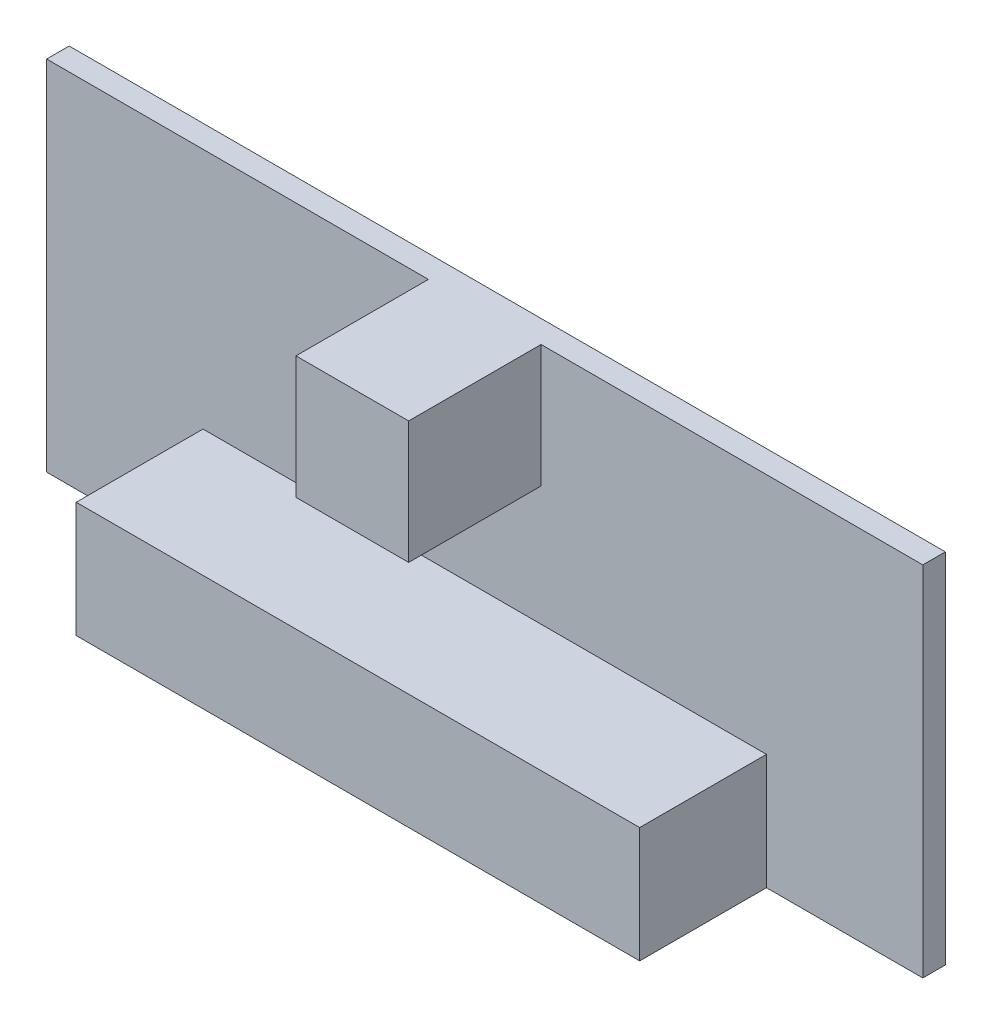
ISO-10303-21;
HEADER;
FILE_DESCRIPTION(('STEP AP214'),'2;1');
FILE_NAME('part.step','',(''),(''),'','','');
FILE_SCHEMA(('AUTOMOTIVE_DESIGN { 1 0 10303 214 1 1 1 1 }'));
ENDSEC;
DATA;
#1=APPLICATION_CONTEXT('core data for automotive mechanical design processes');
#2=APPLICATION_PROTOCOL_DEFINITION('international standard','automotive_design',2000,#1);
#3=PRODUCT_CONTEXT('',#1,'mechanical');
#4=PRODUCT('Part','Part','',(#3));
#5=PRODUCT_RELATED_PRODUCT_CATEGORY('part','',(#4));
#6=PRODUCT_DEFINITION_FORMATION('','',#4);
#7=PRODUCT_DEFINITION_CONTEXT('part definition',#1,'design');
#8=PRODUCT_DEFINITION('design','',#6,#7);
#9=PRODUCT_DEFINITION_SHAPE('','',#8);
#10=(LENGTH_UNIT() NAMED_UNIT(*) SI_UNIT(.MILLI.,.METRE.));
#11=(NAMED_UNIT(*) PLANE_ANGLE_UNIT() SI_UNIT($,.RADIAN.));
#12=(NAMED_UNIT(*) SI_UNIT($,.STERADIAN.) SOLID_ANGLE_UNIT());
#13=UNCERTAINTY_MEASURE_WITH_UNIT(LENGTH_MEASURE(1.E-05),#10,'distance_accuracy_value','');
#14=(GEOMETRIC_REPRESENTATION_CONTEXT(3) GLOBAL_UNCERTAINTY_ASSIGNED_CONTEXT((#13)) GLOBAL_UNIT_ASSIGNED_CONTEXT((#10,
#11,#12)) REPRESENTATION_CONTEXT('',''));
#15=CARTESIAN_POINT('',(0.,0.,0.));
#16=DIRECTION('',(0.,0.,1.));
#17=DIRECTION('',(1.,0.,0.));
#18=AXIS2_PLACEMENT_3D('',#15,#16,#17);
#19=CARTESIAN_POINT('',(-31.1,12.7,1.6));
#20=DIRECTION('',(1.,0.,0.));
#21=DIRECTION('',(0.,0.,-1.));
#22=AXIS2_PLACEMENT_3D('',#19,#20,#21);
#23=PLANE('',#22);
#24=DIRECTION('',(0.,-1.,0.));
#25=VECTOR('',#24,1.);
#26=CARTESIAN_POINT('',(-31.1,12.7,0.));
#27=LINE('',#26,#25);
#28=CARTESIAN_POINT('',(-31.1,12.7,0.));
#29=VERTEX_POINT('',#28);
#30=CARTESIAN_POINT('',(-31.1,-12.7,0.));
#31=VERTEX_POINT('',#30);
#32=EDGE_CURVE('E179',#29,#31,#27,.T.);
#33=ORIENTED_EDGE('',*,*,#32,.T.);
#34=DIRECTION('',(0.,0.,-1.));
#35=VECTOR('',#34,1.);
#36=CARTESIAN_POINT('',(-31.1,-12.7,1.6));
#37=LINE('',#36,#35);
#38=CARTESIAN_POINT('',(-31.1,-12.7,1.6));
#39=VERTEX_POINT('',#38);
#40=EDGE_CURVE('E11',#39,#31,#37,.T.);
#41=ORIENTED_EDGE('',*,*,#40,.F.);
#42=DIRECTION('',(0.,-1.,0.));
#43=VECTOR('',#42,1.);
#44=CARTESIAN_POINT('',(-31.1,12.7,1.6));
#45=LINE('',#44,#43);
#46=CARTESIAN_POINT('',(-31.1,12.7,1.6));
#47=VERTEX_POINT('',#46);
#48=EDGE_CURVE('E176',#47,#39,#45,.T.);
#49=ORIENTED_EDGE('',*,*,#48,.F.);
#50=DIRECTION('',(0.,0.,-1.));
#51=VECTOR('',#50,1.);
#52=CARTESIAN_POINT('',(-31.1,12.7,1.6));
#53=LINE('',#52,#51);
#54=EDGE_CURVE('E193',#47,#29,#53,.T.);
#55=ORIENTED_EDGE('',*,*,#54,.T.);
#56=EDGE_LOOP('',(#33,#41,#49,#55));
#57=FACE_BOUND('',#56,.T.);
#58=ADVANCED_FACE('F39',(#57),#23,.F.);
#59=CARTESIAN_POINT('',(-31.1,-12.7,1.6));
#60=DIRECTION('',(0.,1.,0.));
#61=DIRECTION('',(0.,0.,1.));
#62=AXIS2_PLACEMENT_3D('',#59,#60,#61);
#63=PLANE('',#62);
#64=DIRECTION('',(1.,0.,0.));
#65=VECTOR('',#64,1.);
#66=CARTESIAN_POINT('',(-31.1,-12.7,0.));
#67=LINE('',#66,#65);
#68=CARTESIAN_POINT('',(31.1,-12.7,0.));
#69=VERTEX_POINT('',#68);
#70=EDGE_CURVE('E198',#31,#69,#67,.T.);
#71=ORIENTED_EDGE('',*,*,#70,.T.);
#72=DIRECTION('',(0.,0.,-1.));
#73=VECTOR('',#72,1.);
#74=CARTESIAN_POINT('',(31.1,-12.7,1.6));
#75=LINE('',#74,#73);
#76=CARTESIAN_POINT('',(31.1,-12.7,1.6));
#77=VERTEX_POINT('',#76);
#78=EDGE_CURVE('E46',#77,#69,#75,.T.);
#79=ORIENTED_EDGE('',*,*,#78,.F.);
#80=DIRECTION('',(1.,0.,0.));
#81=VECTOR('',#80,1.);
#82=CARTESIAN_POINT('',(-31.1,-12.7,1.6));
#83=LINE('',#82,#81);
#84=CARTESIAN_POINT('',(20.,-12.7,1.6));
#85=VERTEX_POINT('',#84);
#86=EDGE_CURVE('E181',#85,#77,#83,.T.);
#87=ORIENTED_EDGE('',*,*,#86,.F.);
#88=DIRECTION('',(0.,0.,-1.));
#89=VECTOR('',#88,1.);
#90=CARTESIAN_POINT('',(20.,-12.7,10.6));
#91=LINE('',#90,#89);
#92=CARTESIAN_POINT('',(20.,-12.7,10.6));
#93=VERTEX_POINT('',#92);
#94=EDGE_CURVE('E174',#93,#85,#91,.T.);
#95=ORIENTED_EDGE('',*,*,#94,.F.);
#96=DIRECTION('',(1.,0.,0.));
#97=VECTOR('',#96,1.);
#98=CARTESIAN_POINT('',(-20.,-12.7,10.6));
#99=LINE('',#98,#97);
#100=CARTESIAN_POINT('',(-20.,-12.7,10.6));
#101=VERTEX_POINT('',#100);
#102=EDGE_CURVE('E160',#101,#93,#99,.T.);
#103=ORIENTED_EDGE('',*,*,#102,.F.);
#104=DIRECTION('',(0.,0.,-1.));
#105=VECTOR('',#104,1.);
#106=CARTESIAN_POINT('',(-20.,-12.7,10.6));
#107=LINE('',#106,#105);
#108=CARTESIAN_POINT('',(-20.,-12.7,1.6));
#109=VERTEX_POINT('',#108);
#110=EDGE_CURVE('E177',#101,#109,#107,.T.);
#111=ORIENTED_EDGE('',*,*,#110,.T.);
#112=EDGE_CURVE('E183',#39,#109,#83,.T.);
#113=ORIENTED_EDGE('',*,*,#112,.F.);
#114=ORIENTED_EDGE('',*,*,#40,.T.);
#115=EDGE_LOOP('',(#71,#79,#87,#95,#103,#111,#113,#114));
#116=FACE_BOUND('',#115,.T.);
#117=ADVANCED_FACE('F242',(#116),#63,.F.);
#118=CARTESIAN_POINT('',(31.1,-12.7,1.6));
#119=DIRECTION('',(-1.,0.,0.));
#120=DIRECTION('',(0.,0.,1.));
#121=AXIS2_PLACEMENT_3D('',#118,#119,#120);
#122=PLANE('',#121);
#123=DIRECTION('',(0.,1.,0.));
#124=VECTOR('',#123,1.);
#125=CARTESIAN_POINT('',(31.1,-12.7,0.));
#126=LINE('',#125,#124);
#127=CARTESIAN_POINT('',(31.1,12.7,0.));
#128=VERTEX_POINT('',#127);
#129=EDGE_CURVE('E196',#69,#128,#126,.T.);
#130=ORIENTED_EDGE('',*,*,#129,.T.);
#131=DIRECTION('',(0.,0.,-1.));
#132=VECTOR('',#131,1.);
#133=CARTESIAN_POINT('',(31.1,12.7,1.6));
#134=LINE('',#133,#132);
#135=CARTESIAN_POINT('',(31.1,12.7,1.6));
#136=VERTEX_POINT('',#135);
#137=EDGE_CURVE('E201',#136,#128,#134,.T.);
#138=ORIENTED_EDGE('',*,*,#137,.F.);
#139=DIRECTION('',(0.,1.,0.));
#140=VECTOR('',#139,1.);
#141=CARTESIAN_POINT('',(31.1,-12.7,1.6));
#142=LINE('',#141,#140);
#143=EDGE_CURVE('E190',#77,#136,#142,.T.);
#144=ORIENTED_EDGE('',*,*,#143,.F.);
#145=ORIENTED_EDGE('',*,*,#78,.T.);
#146=EDGE_LOOP('',(#130,#138,#144,#145));
#147=FACE_BOUND('',#146,.T.);
#148=ADVANCED_FACE('F209',(#147),#122,.F.);
#149=CARTESIAN_POINT('',(31.1,12.7,1.6));
#150=DIRECTION('',(0.,-1.,0.));
#151=DIRECTION('',(0.,0.,-1.));
#152=AXIS2_PLACEMENT_3D('',#149,#150,#151);
#153=PLANE('',#152);
#154=DIRECTION('',(-1.,0.,0.));
#155=VECTOR('',#154,1.);
#156=CARTESIAN_POINT('',(31.1,12.7,0.));
#157=LINE('',#156,#155);
#158=EDGE_CURVE('E184',#128,#29,#157,.T.);
#159=ORIENTED_EDGE('',*,*,#158,.T.);
#160=ORIENTED_EDGE('',*,*,#54,.F.);
#161=DIRECTION('',(-1.,0.,0.));
#162=VECTOR('',#161,1.);
#163=CARTESIAN_POINT('',(31.1,12.7,1.6));
#164=LINE('',#163,#162);
#165=CARTESIAN_POINT('',(-4.,12.7,1.6));
#166=VERTEX_POINT('',#165);
#167=EDGE_CURVE('E186',#166,#47,#164,.T.);
#168=ORIENTED_EDGE('',*,*,#167,.F.);
#169=DIRECTION('',(0.,0.,-1.));
#170=VECTOR('',#169,1.);
#171=CARTESIAN_POINT('',(-4.,12.7,11.));
#172=LINE('',#171,#170);
#173=CARTESIAN_POINT('',(-4.,12.7,11.));
#174=VERTEX_POINT('',#173);
#175=EDGE_CURVE('E230',#174,#166,#172,.T.);
#176=ORIENTED_EDGE('',*,*,#175,.F.);
#177=DIRECTION('',(-1.,0.,0.));
#178=VECTOR('',#177,1.);
#179=CARTESIAN_POINT('',(4.,12.7,11.));
#180=LINE('',#179,#178);
#181=CARTESIAN_POINT('',(4.,12.7,11.));
#182=VERTEX_POINT('',#181);
#183=EDGE_CURVE('E142',#182,#174,#180,.T.);
#184=ORIENTED_EDGE('',*,*,#183,.F.);
#185=DIRECTION('',(0.,0.,-1.));
#186=VECTOR('',#185,1.);
#187=CARTESIAN_POINT('',(4.,12.7,11.));
#188=LINE('',#187,#186);
#189=CARTESIAN_POINT('',(4.,12.7,1.6));
#190=VERTEX_POINT('',#189);
#191=EDGE_CURVE('E147',#182,#190,#188,.T.);
#192=ORIENTED_EDGE('',*,*,#191,.T.);
#193=EDGE_CURVE('E188',#136,#190,#164,.T.);
#194=ORIENTED_EDGE('',*,*,#193,.F.);
#195=ORIENTED_EDGE('',*,*,#137,.T.);
#196=EDGE_LOOP('',(#159,#160,#168,#176,#184,#192,#194,#195));
#197=FACE_BOUND('',#196,.T.);
#198=ADVANCED_FACE('F219',(#197),#153,.F.);
#199=CARTESIAN_POINT('',(0.,0.,1.6));
#200=DIRECTION('',(0.,0.,1.));
#201=DIRECTION('',(1.,0.,0.));
#202=AXIS2_PLACEMENT_3D('',#199,#200,#201);
#203=PLANE('',#202);
#204=DIRECTION('',(0.,-1.,0.));
#205=VECTOR('',#204,1.);
#206=CARTESIAN_POINT('',(-4.,12.7,1.6));
#207=LINE('',#206,#205);
#208=CARTESIAN_POINT('',(-4.,4.,1.6));
#209=VERTEX_POINT('',#208);
#210=EDGE_CURVE('E52',#166,#209,#207,.T.);
#211=ORIENTED_EDGE('',*,*,#210,.F.);
#212=ORIENTED_EDGE('',*,*,#167,.T.);
#213=ORIENTED_EDGE('',*,*,#48,.T.);
#214=ORIENTED_EDGE('',*,*,#112,.T.);
#215=DIRECTION('',(0.,-1.,0.));
#216=VECTOR('',#215,1.);
#217=CARTESIAN_POINT('',(-20.,-4.5,1.6));
#218=LINE('',#217,#216);
#219=CARTESIAN_POINT('',(-20.,-4.5,1.6));
#220=VERTEX_POINT('',#219);
#221=EDGE_CURVE('E62',#220,#109,#218,.T.);
#222=ORIENTED_EDGE('',*,*,#221,.F.);
#223=DIRECTION('',(-1.,0.,0.));
#224=VECTOR('',#223,1.);
#225=CARTESIAN_POINT('',(20.,-4.5,1.6));
#226=LINE('',#225,#224);
#227=CARTESIAN_POINT('',(20.,-4.5,1.6));
#228=VERTEX_POINT('',#227);
#229=EDGE_CURVE('E158',#228,#220,#226,.T.);
#230=ORIENTED_EDGE('',*,*,#229,.F.);
#231=DIRECTION('',(0.,1.,0.));
#232=VECTOR('',#231,1.);
#233=CARTESIAN_POINT('',(20.,-12.7,1.6));
#234=LINE('',#233,#232);
#235=EDGE_CURVE('E146',#85,#228,#234,.T.);
#236=ORIENTED_EDGE('',*,*,#235,.F.);
#237=ORIENTED_EDGE('',*,*,#86,.T.);
#238=ORIENTED_EDGE('',*,*,#143,.T.);
#239=ORIENTED_EDGE('',*,*,#193,.T.);
#240=DIRECTION('',(0.,1.,0.));
#241=VECTOR('',#240,1.);
#242=CARTESIAN_POINT('',(4.,4.,1.6));
#243=LINE('',#242,#241);
#244=CARTESIAN_POINT('',(4.,4.,1.6));
#245=VERTEX_POINT('',#244);
#246=EDGE_CURVE('E145',#245,#190,#243,.T.);
#247=ORIENTED_EDGE('',*,*,#246,.F.);
#248=DIRECTION('',(1.,0.,0.));
#249=VECTOR('',#248,1.);
#250=CARTESIAN_POINT('',(-4.,4.,1.6));
#251=LINE('',#250,#249);
#252=EDGE_CURVE('E233',#209,#245,#251,.T.);
#253=ORIENTED_EDGE('',*,*,#252,.F.);
#254=EDGE_LOOP('',(#211,#212,#213,#214,#222,#230,#236,#237,#238,#239,#247,#253));
#255=FACE_BOUND('',#254,.T.);
#256=ADVANCED_FACE('F227',(#255),#203,.T.);
#257=CARTESIAN_POINT('',(0.,0.,0.));
#258=DIRECTION('',(0.,0.,1.));
#259=DIRECTION('',(1.,0.,0.));
#260=AXIS2_PLACEMENT_3D('',#257,#258,#259);
#261=PLANE('',#260);
#262=ORIENTED_EDGE('',*,*,#32,.F.);
#263=ORIENTED_EDGE('',*,*,#158,.F.);
#264=ORIENTED_EDGE('',*,*,#129,.F.);
#265=ORIENTED_EDGE('',*,*,#70,.F.);
#266=EDGE_LOOP('',(#262,#263,#264,#265));
#267=FACE_BOUND('',#266,.T.);
#268=ADVANCED_FACE('F220',(#267),#261,.F.);
#269=CARTESIAN_POINT('',(-20.,-4.5,10.6));
#270=DIRECTION('',(1.,0.,0.));
#271=DIRECTION('',(0.,0.,-1.));
#272=AXIS2_PLACEMENT_3D('',#269,#270,#271);
#273=PLANE('',#272);
#274=ORIENTED_EDGE('',*,*,#221,.T.);
#275=ORIENTED_EDGE('',*,*,#110,.F.);
#276=DIRECTION('',(0.,-1.,0.));
#277=VECTOR('',#276,1.);
#278=CARTESIAN_POINT('',(-20.,-4.5,10.6));
#279=LINE('',#278,#277);
#280=CARTESIAN_POINT('',(-20.,-4.5,10.6));
#281=VERTEX_POINT('',#280);
#282=EDGE_CURVE('E152',#281,#101,#279,.T.);
#283=ORIENTED_EDGE('',*,*,#282,.F.);
#284=DIRECTION('',(0.,0.,-1.));
#285=VECTOR('',#284,1.);
#286=CARTESIAN_POINT('',(-20.,-4.5,10.6));
#287=LINE('',#286,#285);
#288=EDGE_CURVE('E162',#281,#220,#287,.T.);
#289=ORIENTED_EDGE('',*,*,#288,.T.);
#290=EDGE_LOOP('',(#274,#275,#283,#289));
#291=FACE_BOUND('',#290,.T.);
#292=ADVANCED_FACE('F251',(#291),#273,.F.);
#293=CARTESIAN_POINT('',(20.,-12.7,10.6));
#294=DIRECTION('',(-1.,0.,0.));
#295=DIRECTION('',(0.,0.,1.));
#296=AXIS2_PLACEMENT_3D('',#293,#294,#295);
#297=PLANE('',#296);
#298=ORIENTED_EDGE('',*,*,#235,.T.);
#299=DIRECTION('',(0.,0.,-1.));
#300=VECTOR('',#299,1.);
#301=CARTESIAN_POINT('',(20.,-4.5,10.6));
#302=LINE('',#301,#300);
#303=CARTESIAN_POINT('',(20.,-4.5,10.6));
#304=VERTEX_POINT('',#303);
#305=EDGE_CURVE('E168',#304,#228,#302,.T.);
#306=ORIENTED_EDGE('',*,*,#305,.F.);
#307=DIRECTION('',(0.,1.,0.));
#308=VECTOR('',#307,1.);
#309=CARTESIAN_POINT('',(20.,-12.7,10.6));
#310=LINE('',#309,#308);
#311=EDGE_CURVE('E159',#93,#304,#310,.T.);
#312=ORIENTED_EDGE('',*,*,#311,.F.);
#313=ORIENTED_EDGE('',*,*,#94,.T.);
#314=EDGE_LOOP('',(#298,#306,#312,#313));
#315=FACE_BOUND('',#314,.T.);
#316=ADVANCED_FACE('F241',(#315),#297,.F.);
#317=CARTESIAN_POINT('',(20.,-4.5,10.6));
#318=DIRECTION('',(0.,-1.,0.));
#319=DIRECTION('',(0.,0.,-1.));
#320=AXIS2_PLACEMENT_3D('',#317,#318,#319);
#321=PLANE('',#320);
#322=ORIENTED_EDGE('',*,*,#229,.T.);
#323=ORIENTED_EDGE('',*,*,#288,.F.);
#324=DIRECTION('',(-1.,0.,0.));
#325=VECTOR('',#324,1.);
#326=CARTESIAN_POINT('',(20.,-4.5,10.6));
#327=LINE('',#326,#325);
#328=EDGE_CURVE('E165',#304,#281,#327,.T.);
#329=ORIENTED_EDGE('',*,*,#328,.F.);
#330=ORIENTED_EDGE('',*,*,#305,.T.);
#331=EDGE_LOOP('',(#322,#323,#329,#330));
#332=FACE_BOUND('',#331,.T.);
#333=ADVANCED_FACE('F254',(#332),#321,.F.);
#334=CARTESIAN_POINT('',(0.,0.,10.6));
#335=DIRECTION('',(0.,0.,1.));
#336=DIRECTION('',(1.,0.,0.));
#337=AXIS2_PLACEMENT_3D('',#334,#335,#336);
#338=PLANE('',#337);
#339=ORIENTED_EDGE('',*,*,#282,.T.);
#340=ORIENTED_EDGE('',*,*,#102,.T.);
#341=ORIENTED_EDGE('',*,*,#311,.T.);
#342=ORIENTED_EDGE('',*,*,#328,.T.);
#343=EDGE_LOOP('',(#339,#340,#341,#342));
#344=FACE_BOUND('',#343,.T.);
#345=ADVANCED_FACE('F248',(#344),#338,.T.);
#346=CARTESIAN_POINT('',(-4.,12.7,11.));
#347=DIRECTION('',(1.,0.,0.));
#348=DIRECTION('',(0.,0.,-1.));
#349=AXIS2_PLACEMENT_3D('',#346,#347,#348);
#350=PLANE('',#349);
#351=ORIENTED_EDGE('',*,*,#210,.T.);
#352=DIRECTION('',(0.,0.,-1.));
#353=VECTOR('',#352,1.);
#354=CARTESIAN_POINT('',(-4.,4.,11.));
#355=LINE('',#354,#353);
#356=CARTESIAN_POINT('',(-4.,4.,11.));
#357=VERTEX_POINT('',#356);
#358=EDGE_CURVE('E128',#357,#209,#355,.T.);
#359=ORIENTED_EDGE('',*,*,#358,.F.);
#360=DIRECTION('',(0.,-1.,0.));
#361=VECTOR('',#360,1.);
#362=CARTESIAN_POINT('',(-4.,12.7,11.));
#363=LINE('',#362,#361);
#364=EDGE_CURVE('E140',#174,#357,#363,.T.);
#365=ORIENTED_EDGE('',*,*,#364,.F.);
#366=ORIENTED_EDGE('',*,*,#175,.T.);
#367=EDGE_LOOP('',(#351,#359,#365,#366));
#368=FACE_BOUND('',#367,.T.);
#369=ADVANCED_FACE('F148',(#368),#350,.F.);
#370=CARTESIAN_POINT('',(-4.,4.,11.));
#371=DIRECTION('',(0.,1.,0.));
#372=DIRECTION('',(0.,0.,1.));
#373=AXIS2_PLACEMENT_3D('',#370,#371,#372);
#374=PLANE('',#373);
#375=ORIENTED_EDGE('',*,*,#252,.T.);
#376=DIRECTION('',(0.,0.,-1.));
#377=VECTOR('',#376,1.);
#378=CARTESIAN_POINT('',(4.,4.,11.));
#379=LINE('',#378,#377);
#380=CARTESIAN_POINT('',(4.,4.,11.));
#381=VERTEX_POINT('',#380);
#382=EDGE_CURVE('E134',#381,#245,#379,.T.);
#383=ORIENTED_EDGE('',*,*,#382,.F.);
#384=DIRECTION('',(1.,0.,0.));
#385=VECTOR('',#384,1.);
#386=CARTESIAN_POINT('',(-4.,4.,11.));
#387=LINE('',#386,#385);
#388=EDGE_CURVE('E130',#357,#381,#387,.T.);
#389=ORIENTED_EDGE('',*,*,#388,.F.);
#390=ORIENTED_EDGE('',*,*,#358,.T.);
#391=EDGE_LOOP('',(#375,#383,#389,#390));
#392=FACE_BOUND('',#391,.T.);
#393=ADVANCED_FACE('F129',(#392),#374,.F.);
#394=CARTESIAN_POINT('',(4.,4.,11.));
#395=DIRECTION('',(-1.,0.,0.));
#396=DIRECTION('',(0.,0.,1.));
#397=AXIS2_PLACEMENT_3D('',#394,#395,#396);
#398=PLANE('',#397);
#399=ORIENTED_EDGE('',*,*,#246,.T.);
#400=ORIENTED_EDGE('',*,*,#191,.F.);
#401=DIRECTION('',(0.,1.,0.));
#402=VECTOR('',#401,1.);
#403=CARTESIAN_POINT('',(4.,4.,11.));
#404=LINE('',#403,#402);
#405=EDGE_CURVE('E137',#381,#182,#404,.T.);
#406=ORIENTED_EDGE('',*,*,#405,.F.);
#407=ORIENTED_EDGE('',*,*,#382,.T.);
#408=EDGE_LOOP('',(#399,#400,#406,#407));
#409=FACE_BOUND('',#408,.T.);
#410=ADVANCED_FACE('F236',(#409),#398,.F.);
#411=CARTESIAN_POINT('',(0.,0.,11.));
#412=DIRECTION('',(0.,0.,1.));
#413=DIRECTION('',(1.,0.,0.));
#414=AXIS2_PLACEMENT_3D('',#411,#412,#413);
#415=PLANE('',#414);
#416=ORIENTED_EDGE('',*,*,#364,.T.);
#417=ORIENTED_EDGE('',*,*,#388,.T.);
#418=ORIENTED_EDGE('',*,*,#405,.T.);
#419=ORIENTED_EDGE('',*,*,#183,.T.);
#420=EDGE_LOOP('',(#416,#417,#418,#419));
#421=FACE_BOUND('',#420,.T.);
#422=ADVANCED_FACE('F136',(#421),#415,.T.);
#423=CLOSED_SHELL('',(#58,#117,#148,#198,#256,#268,#292,#316,#333,#345,#369,#393,#410,#422));
#424=MANIFOLD_SOLID_BREP('B2',#423);
#425=ADVANCED_BREP_SHAPE_REPRESENTATION('',(#18,#424),#14);
#426=SHAPE_DEFINITION_REPRESENTATION(#9,#425);
ENDSEC;
END-ISO-10303-21;
